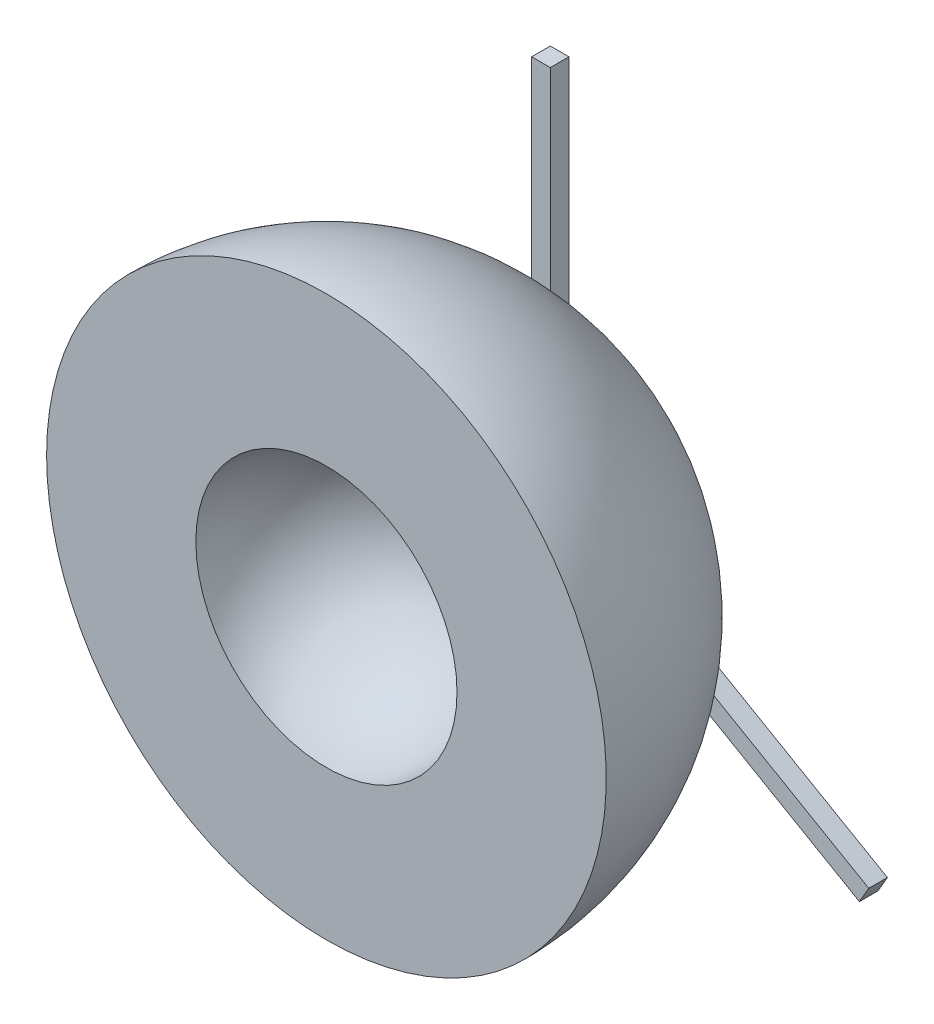
ISO-10303-21;
HEADER;
FILE_DESCRIPTION(('STEP AP214'),'2;1');
FILE_NAME('part.step','',(''),(''),'','','');
FILE_SCHEMA(('AUTOMOTIVE_DESIGN { 1 0 10303 214 1 1 1 1 }'));
ENDSEC;
DATA;
#1=APPLICATION_CONTEXT('core data for automotive mechanical design processes');
#2=APPLICATION_PROTOCOL_DEFINITION('international standard','automotive_design',2000,#1);
#3=PRODUCT_CONTEXT('',#1,'mechanical');
#4=PRODUCT('Part','Part','',(#3));
#5=PRODUCT_RELATED_PRODUCT_CATEGORY('part','',(#4));
#6=PRODUCT_DEFINITION_FORMATION('','',#4);
#7=PRODUCT_DEFINITION_CONTEXT('part definition',#1,'design');
#8=PRODUCT_DEFINITION('design','',#6,#7);
#9=PRODUCT_DEFINITION_SHAPE('','',#8);
#10=(LENGTH_UNIT() NAMED_UNIT(*) SI_UNIT(.MILLI.,.METRE.));
#11=(NAMED_UNIT(*) PLANE_ANGLE_UNIT() SI_UNIT($,.RADIAN.));
#12=(NAMED_UNIT(*) SI_UNIT($,.STERADIAN.) SOLID_ANGLE_UNIT());
#13=UNCERTAINTY_MEASURE_WITH_UNIT(LENGTH_MEASURE(1.E-05),#10,'distance_accuracy_value','');
#14=(GEOMETRIC_REPRESENTATION_CONTEXT(3) GLOBAL_UNCERTAINTY_ASSIGNED_CONTEXT((#13)) GLOBAL_UNIT_ASSIGNED_CONTEXT((#10,
#11,#12)) REPRESENTATION_CONTEXT('',''));
#15=CARTESIAN_POINT('',(0.,0.,0.));
#16=DIRECTION('',(0.,0.,1.));
#17=DIRECTION('',(1.,0.,0.));
#18=AXIS2_PLACEMENT_3D('',#15,#16,#17);
#19=CARTESIAN_POINT('',(0.,0.,0.));
#20=DIRECTION('',(0.,1.,0.));
#21=DIRECTION('',(-1.,0.,0.));
#22=AXIS2_PLACEMENT_3D('',#19,#20,#21);
#23=SPHERICAL_SURFACE('',#22,150.);
#24=CARTESIAN_POINT('',(0.,0.,0.));
#25=DIRECTION('',(0.,0.,-1.));
#26=DIRECTION('',(-1.,0.,0.));
#27=AXIS2_PLACEMENT_3D('',#24,#25,#26);
#28=CIRCLE('',#27,150.);
#29=CARTESIAN_POINT('',(-150.,0.,-1.04744440165294E-12));
#30=VERTEX_POINT('',#29);
#31=EDGE_CURVE('E190',#30,#30,#28,.T.);
#32=ORIENTED_EDGE('',*,*,#31,.T.);
#33=EDGE_LOOP('',(#32));
#34=FACE_BOUND('',#33,.T.);
#35=CARTESIAN_POINT('',(0.,0.,-125.));
#36=DIRECTION('',(0.,0.,1.));
#37=DIRECTION('',(1.,0.,0.));
#38=AXIS2_PLACEMENT_3D('',#35,#36,#37);
#39=CIRCLE('',#38,82.915619758885);
#40=CARTESIAN_POINT('',(-5.,82.7647267862342,-125.));
#41=VERTEX_POINT('',#40);
#42=CARTESIAN_POINT('',(5.,82.7647267862342,-125.));
#43=VERTEX_POINT('',#42);
#44=EDGE_CURVE('E199',#41,#43,#39,.F.);
#45=ORIENTED_EDGE('',*,*,#44,.T.);
#46=CARTESIAN_POINT('',(5.,0.,0.));
#47=DIRECTION('',(-1.,0.,0.));
#48=DIRECTION('',(0.,0.,1.));
#49=AXIS2_PLACEMENT_3D('',#46,#47,#48);
#50=CIRCLE('',#49,149.916643505649);
#51=CARTESIAN_POINT('',(5.,96.1769203083567,-115.));
#52=VERTEX_POINT('',#51);
#53=EDGE_CURVE('E202',#43,#52,#50,.F.);
#54=ORIENTED_EDGE('',*,*,#53,.T.);
#55=CARTESIAN_POINT('',(0.,0.,-115.));
#56=DIRECTION('',(0.,0.,-1.));
#57=DIRECTION('',(-1.,0.,0.));
#58=AXIS2_PLACEMENT_3D('',#55,#56,#57);
#59=CIRCLE('',#58,96.3068014212911);
#60=CARTESIAN_POINT('',(-5.,96.1769203083567,-115.));
#61=VERTEX_POINT('',#60);
#62=EDGE_CURVE('E193',#52,#61,#59,.F.);
#63=ORIENTED_EDGE('',*,*,#62,.T.);
#64=CARTESIAN_POINT('',(-5.,0.,0.));
#65=DIRECTION('',(1.,0.,0.));
#66=DIRECTION('',(0.,0.,-1.));
#67=AXIS2_PLACEMENT_3D('',#64,#65,#66);
#68=CIRCLE('',#67,149.916643505649);
#69=EDGE_CURVE('E196',#61,#41,#68,.F.);
#70=ORIENTED_EDGE('',*,*,#69,.T.);
#71=EDGE_LOOP('',(#45,#54,#63,#70));
#72=FACE_BOUND('',#71,.T.);
#73=CARTESIAN_POINT('',(2.50000000000003,4.3301270189222,0.));
#74=DIRECTION('',(-0.500000000000004,-0.866025403784436,0.));
#75=DIRECTION('',(0.866025403784436,-0.500000000000004,0.));
#76=AXIS2_PLACEMENT_3D('',#73,#74,#75);
#77=CIRCLE('',#76,149.916643505649);
#78=CARTESIAN_POINT('',(85.7916562447882,-43.7583331352565,-115.));
#79=VERTEX_POINT('',#78);
#80=CARTESIAN_POINT('',(74.1763559341571,-37.0522363741953,-125.));
#81=VERTEX_POINT('',#80);
#82=EDGE_CURVE('E211',#79,#81,#77,.F.);
#83=ORIENTED_EDGE('',*,*,#82,.T.);
#84=CARTESIAN_POINT('',(0.,0.,-125.));
#85=DIRECTION('',(0.,0.,1.));
#86=DIRECTION('',(1.,0.,0.));
#87=AXIS2_PLACEMENT_3D('',#84,#85,#86);
#88=CIRCLE('',#87,82.915619758885);
#89=CARTESIAN_POINT('',(69.1763559341571,-45.7124904120397,-125.));
#90=VERTEX_POINT('',#89);
#91=EDGE_CURVE('E214',#81,#90,#88,.F.);
#92=ORIENTED_EDGE('',*,*,#91,.T.);
#93=CARTESIAN_POINT('',(-2.50000000000002,-4.33012701892219,0.));
#94=DIRECTION('',(0.500000000000004,0.866025403784436,0.));
#95=DIRECTION('',(-0.866025403784436,0.500000000000004,0.));
#96=AXIS2_PLACEMENT_3D('',#93,#94,#95);
#97=CIRCLE('',#96,149.916643505649);
#98=CARTESIAN_POINT('',(80.7916562447882,-52.4185871731009,-115.));
#99=VERTEX_POINT('',#98);
#100=EDGE_CURVE('E205',#90,#99,#97,.F.);
#101=ORIENTED_EDGE('',*,*,#100,.T.);
#102=CARTESIAN_POINT('',(0.,0.,-115.));
#103=DIRECTION('',(0.,0.,-1.));
#104=DIRECTION('',(-1.,0.,0.));
#105=AXIS2_PLACEMENT_3D('',#102,#103,#104);
#106=CIRCLE('',#105,96.3068014212911);
#107=EDGE_CURVE('E208',#99,#79,#106,.F.);
#108=ORIENTED_EDGE('',*,*,#107,.T.);
#109=EDGE_LOOP('',(#83,#92,#101,#108));
#110=FACE_BOUND('',#109,.T.);
#111=CARTESIAN_POINT('',(-2.49999999999996,4.33012701892222,0.));
#112=DIRECTION('',(0.499999999999992,-0.866025403784443,0.));
#113=DIRECTION('',(0.866025403784443,0.499999999999992,0.));
#114=AXIS2_PLACEMENT_3D('',#111,#112,#113);
#115=CIRCLE('',#114,149.916643505649);
#116=CARTESIAN_POINT('',(-74.1763559341576,-37.0522363741943,-125.));
#117=VERTEX_POINT('',#116);
#118=CARTESIAN_POINT('',(-85.7916562447888,-43.7583331352554,-115.));
#119=VERTEX_POINT('',#118);
#120=EDGE_CURVE('E40',#117,#119,#115,.F.);
#121=ORIENTED_EDGE('',*,*,#120,.T.);
#122=CARTESIAN_POINT('',(0.,0.,-115.));
#123=DIRECTION('',(0.,0.,-1.));
#124=DIRECTION('',(-1.,0.,0.));
#125=AXIS2_PLACEMENT_3D('',#122,#123,#124);
#126=CIRCLE('',#125,96.3068014212911);
#127=CARTESIAN_POINT('',(-80.7916562447889,-52.4185871730998,-115.));
#128=VERTEX_POINT('',#127);
#129=EDGE_CURVE('E11',#119,#128,#126,.F.);
#130=ORIENTED_EDGE('',*,*,#129,.T.);
#131=CARTESIAN_POINT('',(2.49999999999996,-4.33012701892221,0.));
#132=DIRECTION('',(-0.499999999999992,0.866025403784443,0.));
#133=DIRECTION('',(-0.866025403784443,-0.499999999999992,0.));
#134=AXIS2_PLACEMENT_3D('',#131,#132,#133);
#135=CIRCLE('',#134,149.916643505649);
#136=CARTESIAN_POINT('',(-69.1763559341577,-45.7124904120387,-125.));
#137=VERTEX_POINT('',#136);
#138=EDGE_CURVE('E217',#128,#137,#135,.F.);
#139=ORIENTED_EDGE('',*,*,#138,.T.);
#140=CARTESIAN_POINT('',(0.,0.,-125.));
#141=DIRECTION('',(0.,0.,1.));
#142=DIRECTION('',(1.,0.,0.));
#143=AXIS2_PLACEMENT_3D('',#140,#141,#142);
#144=CIRCLE('',#143,82.915619758885);
#145=EDGE_CURVE('E220',#137,#117,#144,.F.);
#146=ORIENTED_EDGE('',*,*,#145,.T.);
#147=EDGE_LOOP('',(#121,#130,#139,#146));
#148=FACE_BOUND('',#147,.T.);
#149=ADVANCED_FACE('F33',(#34,#72,#110,#148),#23,.T.);
#150=CARTESIAN_POINT('',(0.,0.,0.));
#151=DIRECTION('',(0.,1.,0.));
#152=DIRECTION('',(-1.,0.,0.));
#153=AXIS2_PLACEMENT_3D('',#150,#151,#152);
#154=SPHERICAL_SURFACE('',#153,70.);
#155=CARTESIAN_POINT('',(0.,0.,0.));
#156=DIRECTION('',(0.,0.,-1.));
#157=DIRECTION('',(-1.,0.,0.));
#158=AXIS2_PLACEMENT_3D('',#155,#156,#157);
#159=SPHERICAL_SURFACE('',#158,70.);
#160=CARTESIAN_POINT('',(0.,0.,0.));
#161=DIRECTION('',(0.,0.,-1.));
#162=DIRECTION('',(-1.,0.,0.));
#163=AXIS2_PLACEMENT_3D('',#160,#161,#162);
#164=CIRCLE('',#163,70.);
#165=CARTESIAN_POINT('',(-70.,0.,-4.88807387438039E-13));
#166=VERTEX_POINT('',#165);
#167=EDGE_CURVE('E187',#166,#166,#164,.T.);
#168=ORIENTED_EDGE('',*,*,#167,.F.);
#169=EDGE_LOOP('',(#168));
#170=FACE_BOUND('',#169,.T.);
#171=ADVANCED_FACE('F239',(#170),#159,.F.);
#172=CARTESIAN_POINT('',(0.,0.,0.));
#173=DIRECTION('',(0.,0.,-1.));
#174=DIRECTION('',(-1.,0.,0.));
#175=AXIS2_PLACEMENT_3D('',#172,#173,#174);
#176=PLANE('',#175);
#177=ORIENTED_EDGE('',*,*,#167,.T.);
#178=EDGE_LOOP('',(#177));
#179=FACE_BOUND('',#178,.T.);
#180=ORIENTED_EDGE('',*,*,#31,.F.);
#181=EDGE_LOOP('',(#180));
#182=FACE_BOUND('',#181,.T.);
#183=ADVANCED_FACE('F246',(#179,#182),#176,.F.);
#184=CARTESIAN_POINT('',(5.,200.,-115.));
#185=DIRECTION('',(-1.,0.,0.));
#186=DIRECTION('',(0.,0.,1.));
#187=AXIS2_PLACEMENT_3D('',#184,#185,#186);
#188=PLANE('',#187);
#189=ORIENTED_EDGE('',*,*,#53,.F.);
#190=DIRECTION('',(0.,-1.,0.));
#191=VECTOR('',#190,1.);
#192=CARTESIAN_POINT('',(5.,200.,-125.));
#193=LINE('',#192,#191);
#194=CARTESIAN_POINT('',(5.,200.,-125.));
#195=VERTEX_POINT('',#194);
#196=EDGE_CURVE('E184',#195,#43,#193,.T.);
#197=ORIENTED_EDGE('',*,*,#196,.F.);
#198=DIRECTION('',(0.,0.,-1.));
#199=VECTOR('',#198,1.);
#200=CARTESIAN_POINT('',(5.,200.,-115.));
#201=LINE('',#200,#199);
#202=CARTESIAN_POINT('',(5.,200.,-115.));
#203=VERTEX_POINT('',#202);
#204=EDGE_CURVE('E167',#203,#195,#201,.T.);
#205=ORIENTED_EDGE('',*,*,#204,.F.);
#206=DIRECTION('',(0.,-1.,0.));
#207=VECTOR('',#206,1.);
#208=CARTESIAN_POINT('',(5.,200.,-115.));
#209=LINE('',#208,#207);
#210=EDGE_CURVE('E176',#203,#52,#209,.T.);
#211=ORIENTED_EDGE('',*,*,#210,.T.);
#212=EDGE_LOOP('',(#189,#197,#205,#211));
#213=FACE_BOUND('',#212,.T.);
#214=ADVANCED_FACE('F294',(#213),#188,.F.);
#215=CARTESIAN_POINT('',(-5.,200.,-125.));
#216=DIRECTION('',(0.,0.,1.));
#217=DIRECTION('',(1.,0.,0.));
#218=AXIS2_PLACEMENT_3D('',#215,#216,#217);
#219=PLANE('',#218);
#220=ORIENTED_EDGE('',*,*,#44,.F.);
#221=DIRECTION('',(0.,-1.,0.));
#222=VECTOR('',#221,1.);
#223=CARTESIAN_POINT('',(-5.,200.,-125.));
#224=LINE('',#223,#222);
#225=CARTESIAN_POINT('',(-5.,200.,-125.));
#226=VERTEX_POINT('',#225);
#227=EDGE_CURVE('E181',#226,#41,#224,.T.);
#228=ORIENTED_EDGE('',*,*,#227,.F.);
#229=DIRECTION('',(-1.,0.,0.));
#230=VECTOR('',#229,1.);
#231=CARTESIAN_POINT('',(-5.,200.,-125.));
#232=LINE('',#231,#230);
#233=EDGE_CURVE('E170',#195,#226,#232,.T.);
#234=ORIENTED_EDGE('',*,*,#233,.F.);
#235=ORIENTED_EDGE('',*,*,#196,.T.);
#236=EDGE_LOOP('',(#220,#228,#234,#235));
#237=FACE_BOUND('',#236,.T.);
#238=ADVANCED_FACE('F290',(#237),#219,.F.);
#239=CARTESIAN_POINT('',(-5.,200.,-115.));
#240=DIRECTION('',(1.,0.,0.));
#241=DIRECTION('',(0.,0.,-1.));
#242=AXIS2_PLACEMENT_3D('',#239,#240,#241);
#243=PLANE('',#242);
#244=ORIENTED_EDGE('',*,*,#69,.F.);
#245=DIRECTION('',(0.,-1.,0.));
#246=VECTOR('',#245,1.);
#247=CARTESIAN_POINT('',(-5.,200.,-115.));
#248=LINE('',#247,#246);
#249=CARTESIAN_POINT('',(-5.,200.,-115.));
#250=VERTEX_POINT('',#249);
#251=EDGE_CURVE('E179',#250,#61,#248,.T.);
#252=ORIENTED_EDGE('',*,*,#251,.F.);
#253=DIRECTION('',(0.,0.,1.));
#254=VECTOR('',#253,1.);
#255=CARTESIAN_POINT('',(-5.,200.,-115.));
#256=LINE('',#255,#254);
#257=EDGE_CURVE('E172',#226,#250,#256,.T.);
#258=ORIENTED_EDGE('',*,*,#257,.F.);
#259=ORIENTED_EDGE('',*,*,#227,.T.);
#260=EDGE_LOOP('',(#244,#252,#258,#259));
#261=FACE_BOUND('',#260,.T.);
#262=ADVANCED_FACE('F286',(#261),#243,.F.);
#263=CARTESIAN_POINT('',(-5.,200.,-115.));
#264=DIRECTION('',(0.,0.,-1.));
#265=DIRECTION('',(-1.,0.,0.));
#266=AXIS2_PLACEMENT_3D('',#263,#264,#265);
#267=PLANE('',#266);
#268=ORIENTED_EDGE('',*,*,#62,.F.);
#269=ORIENTED_EDGE('',*,*,#210,.F.);
#270=DIRECTION('',(1.,0.,0.));
#271=VECTOR('',#270,1.);
#272=CARTESIAN_POINT('',(-5.,200.,-115.));
#273=LINE('',#272,#271);
#274=EDGE_CURVE('E174',#250,#203,#273,.T.);
#275=ORIENTED_EDGE('',*,*,#274,.F.);
#276=ORIENTED_EDGE('',*,*,#251,.T.);
#277=EDGE_LOOP('',(#268,#269,#275,#276));
#278=FACE_BOUND('',#277,.T.);
#279=ADVANCED_FACE('F282',(#278),#267,.F.);
#280=CARTESIAN_POINT('',(0.,200.,0.));
#281=DIRECTION('',(0.,-1.,0.));
#282=DIRECTION('',(0.,0.,-1.));
#283=AXIS2_PLACEMENT_3D('',#280,#281,#282);
#284=PLANE('',#283);
#285=ORIENTED_EDGE('',*,*,#204,.T.);
#286=ORIENTED_EDGE('',*,*,#233,.T.);
#287=ORIENTED_EDGE('',*,*,#257,.T.);
#288=ORIENTED_EDGE('',*,*,#274,.T.);
#289=EDGE_LOOP('',(#285,#286,#287,#288));
#290=FACE_BOUND('',#289,.T.);
#291=ADVANCED_FACE('F279',(#290),#284,.F.);
#292=CARTESIAN_POINT('',(170.705080756887,-104.330127018923,-125.));
#293=DIRECTION('',(0.,0.,1.));
#294=DIRECTION('',(1.,0.,0.));
#295=AXIS2_PLACEMENT_3D('',#292,#293,#294);
#296=PLANE('',#295);
#297=ORIENTED_EDGE('',*,*,#91,.F.);
#298=DIRECTION('',(-0.866025403784436,0.500000000000004,0.));
#299=VECTOR('',#298,1.);
#300=CARTESIAN_POINT('',(175.705080756887,-95.6698729810786,-125.));
#301=LINE('',#300,#299);
#302=CARTESIAN_POINT('',(175.705080756887,-95.6698729810786,-125.));
#303=VERTEX_POINT('',#302);
#304=EDGE_CURVE('E164',#303,#81,#301,.T.);
#305=ORIENTED_EDGE('',*,*,#304,.F.);
#306=DIRECTION('',(0.500000000000004,0.866025403784436,0.));
#307=VECTOR('',#306,1.);
#308=CARTESIAN_POINT('',(170.705080756887,-104.330127018923,-125.));
#309=LINE('',#308,#307);
#310=CARTESIAN_POINT('',(170.705080756887,-104.330127018923,-125.));
#311=VERTEX_POINT('',#310);
#312=EDGE_CURVE('E144',#311,#303,#309,.T.);
#313=ORIENTED_EDGE('',*,*,#312,.F.);
#314=DIRECTION('',(-0.866025403784436,0.500000000000004,0.));
#315=VECTOR('',#314,1.);
#316=CARTESIAN_POINT('',(170.705080756887,-104.330127018923,-125.));
#317=LINE('',#316,#315);
#318=EDGE_CURVE('E157',#311,#90,#317,.T.);
#319=ORIENTED_EDGE('',*,*,#318,.T.);
#320=EDGE_LOOP('',(#297,#305,#313,#319));
#321=FACE_BOUND('',#320,.T.);
#322=ADVANCED_FACE('F263',(#321),#296,.F.);
#323=CARTESIAN_POINT('',(175.705080756887,-95.6698729810786,-115.));
#324=DIRECTION('',(-0.500000000000004,-0.866025403784436,0.));
#325=DIRECTION('',(0.866025403784436,-0.500000000000004,0.));
#326=AXIS2_PLACEMENT_3D('',#323,#324,#325);
#327=PLANE('',#326);
#328=ORIENTED_EDGE('',*,*,#82,.F.);
#329=DIRECTION('',(-0.866025403784436,0.500000000000004,0.));
#330=VECTOR('',#329,1.);
#331=CARTESIAN_POINT('',(175.705080756887,-95.6698729810786,-115.));
#332=LINE('',#331,#330);
#333=CARTESIAN_POINT('',(175.705080756887,-95.6698729810786,-115.));
#334=VERTEX_POINT('',#333);
#335=EDGE_CURVE('E161',#334,#79,#332,.T.);
#336=ORIENTED_EDGE('',*,*,#335,.F.);
#337=DIRECTION('',(0.,0.,1.));
#338=VECTOR('',#337,1.);
#339=CARTESIAN_POINT('',(175.705080756887,-95.6698729810786,-115.));
#340=LINE('',#339,#338);
#341=EDGE_CURVE('E147',#303,#334,#340,.T.);
#342=ORIENTED_EDGE('',*,*,#341,.F.);
#343=ORIENTED_EDGE('',*,*,#304,.T.);
#344=EDGE_LOOP('',(#328,#336,#342,#343));
#345=FACE_BOUND('',#344,.T.);
#346=ADVANCED_FACE('F253',(#345),#327,.F.);
#347=CARTESIAN_POINT('',(170.705080756887,-104.330127018923,-115.));
#348=DIRECTION('',(0.,0.,-1.));
#349=DIRECTION('',(-1.,0.,0.));
#350=AXIS2_PLACEMENT_3D('',#347,#348,#349);
#351=PLANE('',#350);
#352=ORIENTED_EDGE('',*,*,#107,.F.);
#353=DIRECTION('',(-0.866025403784436,0.500000000000004,0.));
#354=VECTOR('',#353,1.);
#355=CARTESIAN_POINT('',(170.705080756887,-104.330127018923,-115.));
#356=LINE('',#355,#354);
#357=CARTESIAN_POINT('',(170.705080756887,-104.330127018923,-115.));
#358=VERTEX_POINT('',#357);
#359=EDGE_CURVE('E55',#358,#99,#356,.T.);
#360=ORIENTED_EDGE('',*,*,#359,.F.);
#361=DIRECTION('',(-0.500000000000004,-0.866025403784436,0.));
#362=VECTOR('',#361,1.);
#363=CARTESIAN_POINT('',(170.705080756887,-104.330127018923,-115.));
#364=LINE('',#363,#362);
#365=EDGE_CURVE('E153',#334,#358,#364,.T.);
#366=ORIENTED_EDGE('',*,*,#365,.F.);
#367=ORIENTED_EDGE('',*,*,#335,.T.);
#368=EDGE_LOOP('',(#352,#360,#366,#367));
#369=FACE_BOUND('',#368,.T.);
#370=ADVANCED_FACE('F257',(#369),#351,.F.);
#371=CARTESIAN_POINT('',(170.705080756887,-104.330127018923,-115.));
#372=DIRECTION('',(0.500000000000004,0.866025403784436,0.));
#373=DIRECTION('',(-0.866025403784436,0.500000000000004,0.));
#374=AXIS2_PLACEMENT_3D('',#371,#372,#373);
#375=PLANE('',#374);
#376=ORIENTED_EDGE('',*,*,#100,.F.);
#377=ORIENTED_EDGE('',*,*,#318,.F.);
#378=DIRECTION('',(0.,0.,-1.));
#379=VECTOR('',#378,1.);
#380=CARTESIAN_POINT('',(170.705080756887,-104.330127018923,-115.));
#381=LINE('',#380,#379);
#382=EDGE_CURVE('E155',#358,#311,#381,.T.);
#383=ORIENTED_EDGE('',*,*,#382,.F.);
#384=ORIENTED_EDGE('',*,*,#359,.T.);
#385=EDGE_LOOP('',(#376,#377,#383,#384));
#386=FACE_BOUND('',#385,.T.);
#387=ADVANCED_FACE('F264',(#386),#375,.F.);
#388=CARTESIAN_POINT('',(173.205080756887,-100.000000000001,0.));
#389=DIRECTION('',(-0.866025403784436,0.500000000000004,0.));
#390=DIRECTION('',(-0.500000000000004,-0.866025403784436,0.));
#391=AXIS2_PLACEMENT_3D('',#388,#389,#390);
#392=PLANE('',#391);
#393=ORIENTED_EDGE('',*,*,#312,.T.);
#394=ORIENTED_EDGE('',*,*,#341,.T.);
#395=ORIENTED_EDGE('',*,*,#365,.T.);
#396=ORIENTED_EDGE('',*,*,#382,.T.);
#397=EDGE_LOOP('',(#393,#394,#395,#396));
#398=FACE_BOUND('',#397,.T.);
#399=ADVANCED_FACE('F259',(#398),#392,.F.);
#400=CARTESIAN_POINT('',(-170.705080756889,-104.330127018921,-115.));
#401=DIRECTION('',(0.,0.,-1.));
#402=DIRECTION('',(-1.,0.,0.));
#403=AXIS2_PLACEMENT_3D('',#400,#401,#402);
#404=PLANE('',#403);
#405=ORIENTED_EDGE('',*,*,#129,.F.);
#406=DIRECTION('',(0.866025403784443,0.499999999999992,0.));
#407=VECTOR('',#406,1.);
#408=CARTESIAN_POINT('',(-175.705080756889,-95.6698729810762,-115.));
#409=LINE('',#408,#407);
#410=CARTESIAN_POINT('',(-175.705080756889,-95.6698729810762,-115.));
#411=VERTEX_POINT('',#410);
#412=EDGE_CURVE('E127',#411,#119,#409,.T.);
#413=ORIENTED_EDGE('',*,*,#412,.F.);
#414=DIRECTION('',(-0.499999999999992,0.866025403784443,0.));
#415=VECTOR('',#414,1.);
#416=CARTESIAN_POINT('',(-170.705080756889,-104.330127018921,-115.));
#417=LINE('',#416,#415);
#418=CARTESIAN_POINT('',(-170.705080756889,-104.330127018921,-115.));
#419=VERTEX_POINT('',#418);
#420=EDGE_CURVE('E134',#419,#411,#417,.T.);
#421=ORIENTED_EDGE('',*,*,#420,.F.);
#422=DIRECTION('',(0.866025403784443,0.499999999999992,0.));
#423=VECTOR('',#422,1.);
#424=CARTESIAN_POINT('',(-170.705080756889,-104.330127018921,-115.));
#425=LINE('',#424,#423);
#426=EDGE_CURVE('E226',#419,#128,#425,.T.);
#427=ORIENTED_EDGE('',*,*,#426,.T.);
#428=EDGE_LOOP('',(#405,#413,#421,#427));
#429=FACE_BOUND('',#428,.T.);
#430=ADVANCED_FACE('F143',(#429),#404,.F.);
#431=CARTESIAN_POINT('',(-175.705080756889,-95.6698729810762,-125.));
#432=DIRECTION('',(0.499999999999992,-0.866025403784443,0.));
#433=DIRECTION('',(0.866025403784443,0.499999999999992,0.));
#434=AXIS2_PLACEMENT_3D('',#431,#432,#433);
#435=PLANE('',#434);
#436=ORIENTED_EDGE('',*,*,#120,.F.);
#437=DIRECTION('',(0.866025403784443,0.499999999999992,0.));
#438=VECTOR('',#437,1.);
#439=CARTESIAN_POINT('',(-175.705080756889,-95.6698729810762,-125.));
#440=LINE('',#439,#438);
#441=CARTESIAN_POINT('',(-175.705080756889,-95.6698729810762,-125.));
#442=VERTEX_POINT('',#441);
#443=EDGE_CURVE('E130',#442,#117,#440,.T.);
#444=ORIENTED_EDGE('',*,*,#443,.F.);
#445=DIRECTION('',(0.,0.,-1.));
#446=VECTOR('',#445,1.);
#447=CARTESIAN_POINT('',(-175.705080756889,-95.6698729810762,-125.));
#448=LINE('',#447,#446);
#449=EDGE_CURVE('E123',#411,#442,#448,.T.);
#450=ORIENTED_EDGE('',*,*,#449,.F.);
#451=ORIENTED_EDGE('',*,*,#412,.T.);
#452=EDGE_LOOP('',(#436,#444,#450,#451));
#453=FACE_BOUND('',#452,.T.);
#454=ADVANCED_FACE('F125',(#453),#435,.F.);
#455=CARTESIAN_POINT('',(-170.705080756889,-104.330127018921,-125.));
#456=DIRECTION('',(0.,0.,1.));
#457=DIRECTION('',(1.,0.,0.));
#458=AXIS2_PLACEMENT_3D('',#455,#456,#457);
#459=PLANE('',#458);
#460=ORIENTED_EDGE('',*,*,#145,.F.);
#461=DIRECTION('',(0.866025403784443,0.499999999999992,0.));
#462=VECTOR('',#461,1.);
#463=CARTESIAN_POINT('',(-170.705080756889,-104.330127018921,-125.));
#464=LINE('',#463,#462);
#465=CARTESIAN_POINT('',(-170.705080756889,-104.330127018921,-125.));
#466=VERTEX_POINT('',#465);
#467=EDGE_CURVE('E47',#466,#137,#464,.T.);
#468=ORIENTED_EDGE('',*,*,#467,.F.);
#469=DIRECTION('',(0.499999999999992,-0.866025403784443,0.));
#470=VECTOR('',#469,1.);
#471=CARTESIAN_POINT('',(-170.705080756889,-104.330127018921,-125.));
#472=LINE('',#471,#470);
#473=EDGE_CURVE('E133',#442,#466,#472,.T.);
#474=ORIENTED_EDGE('',*,*,#473,.F.);
#475=ORIENTED_EDGE('',*,*,#443,.T.);
#476=EDGE_LOOP('',(#460,#468,#474,#475));
#477=FACE_BOUND('',#476,.T.);
#478=ADVANCED_FACE('F224',(#477),#459,.F.);
#479=CARTESIAN_POINT('',(-170.705080756889,-104.330127018921,-125.));
#480=DIRECTION('',(-0.499999999999992,0.866025403784443,0.));
#481=DIRECTION('',(-0.866025403784443,-0.499999999999992,0.));
#482=AXIS2_PLACEMENT_3D('',#479,#480,#481);
#483=PLANE('',#482);
#484=ORIENTED_EDGE('',*,*,#138,.F.);
#485=ORIENTED_EDGE('',*,*,#426,.F.);
#486=DIRECTION('',(0.,0.,1.));
#487=VECTOR('',#486,1.);
#488=CARTESIAN_POINT('',(-170.705080756889,-104.330127018921,-125.));
#489=LINE('',#488,#487);
#490=EDGE_CURVE('E138',#466,#419,#489,.T.);
#491=ORIENTED_EDGE('',*,*,#490,.F.);
#492=ORIENTED_EDGE('',*,*,#467,.T.);
#493=EDGE_LOOP('',(#484,#485,#491,#492));
#494=FACE_BOUND('',#493,.T.);
#495=ADVANCED_FACE('F229',(#494),#483,.F.);
#496=CARTESIAN_POINT('',(-173.205080756889,-99.9999999999984,0.));
#497=DIRECTION('',(0.866025403784443,0.499999999999992,0.));
#498=DIRECTION('',(-0.499999999999992,0.866025403784443,0.));
#499=AXIS2_PLACEMENT_3D('',#496,#497,#498);
#500=PLANE('',#499);
#501=ORIENTED_EDGE('',*,*,#420,.T.);
#502=ORIENTED_EDGE('',*,*,#449,.T.);
#503=ORIENTED_EDGE('',*,*,#473,.T.);
#504=ORIENTED_EDGE('',*,*,#490,.T.);
#505=EDGE_LOOP('',(#501,#502,#503,#504));
#506=FACE_BOUND('',#505,.T.);
#507=ADVANCED_FACE('F137',(#506),#500,.F.);
#508=CLOSED_SHELL('',(#149,#171,#183,#214,#238,#262,#279,#291,#322,#346,#370,#387,#399,#430,
#454,#478,#495,#507));
#509=MANIFOLD_SOLID_BREP('B2',#508);
#510=ADVANCED_BREP_SHAPE_REPRESENTATION('',(#18,#509),#14);
#511=SHAPE_DEFINITION_REPRESENTATION(#9,#510);
ENDSEC;
END-ISO-10303-21;
